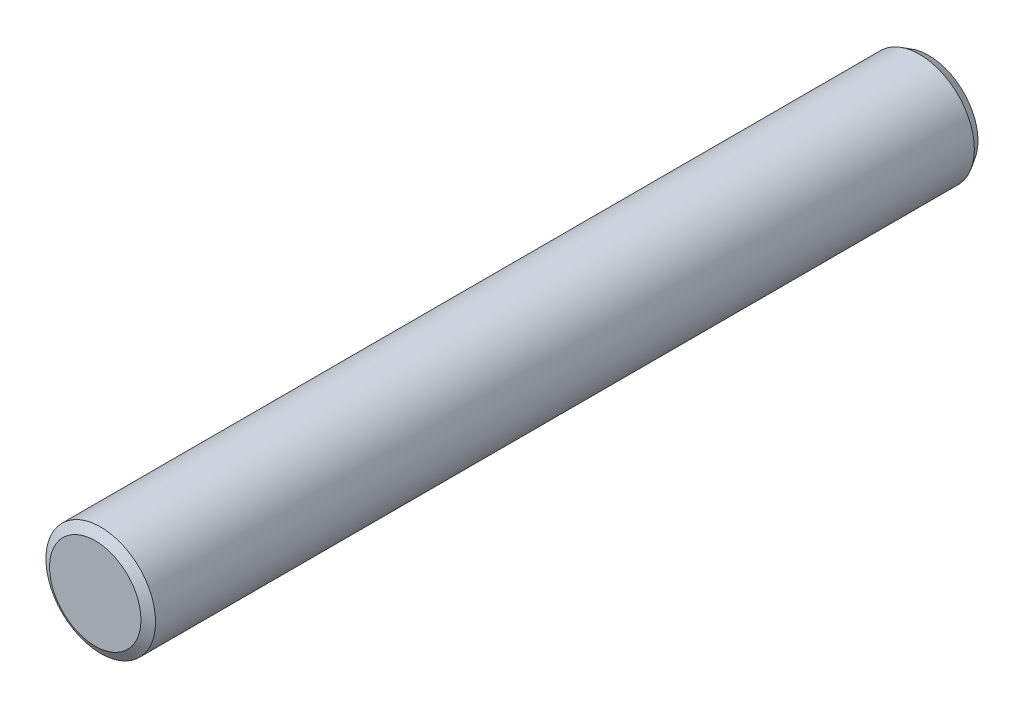
ISO-10303-21;
HEADER;
FILE_DESCRIPTION(('STEP AP214'),'2;1');
FILE_NAME('part.step','',(''),(''),'','','');
FILE_SCHEMA(('AUTOMOTIVE_DESIGN { 1 0 10303 214 1 1 1 1 }'));
ENDSEC;
DATA;
#1=APPLICATION_CONTEXT('core data for automotive mechanical design processes');
#2=APPLICATION_PROTOCOL_DEFINITION('international standard','automotive_design',2000,#1);
#3=PRODUCT_CONTEXT('',#1,'mechanical');
#4=PRODUCT('Part','Part','',(#3));
#5=PRODUCT_RELATED_PRODUCT_CATEGORY('part','',(#4));
#6=PRODUCT_DEFINITION_FORMATION('','',#4);
#7=PRODUCT_DEFINITION_CONTEXT('part definition',#1,'design');
#8=PRODUCT_DEFINITION('design','',#6,#7);
#9=PRODUCT_DEFINITION_SHAPE('','',#8);
#10=(LENGTH_UNIT() NAMED_UNIT(*) SI_UNIT(.MILLI.,.METRE.));
#11=(NAMED_UNIT(*) PLANE_ANGLE_UNIT() SI_UNIT($,.RADIAN.));
#12=(NAMED_UNIT(*) SI_UNIT($,.STERADIAN.) SOLID_ANGLE_UNIT());
#13=UNCERTAINTY_MEASURE_WITH_UNIT(LENGTH_MEASURE(1.E-05),#10,'distance_accuracy_value','');
#14=(GEOMETRIC_REPRESENTATION_CONTEXT(3) GLOBAL_UNCERTAINTY_ASSIGNED_CONTEXT((#13)) GLOBAL_UNIT_ASSIGNED_CONTEXT((#10,
#11,#12)) REPRESENTATION_CONTEXT('',''));
#15=CARTESIAN_POINT('',(0.,0.,0.));
#16=DIRECTION('',(0.,0.,1.));
#17=DIRECTION('',(1.,0.,0.));
#18=AXIS2_PLACEMENT_3D('',#15,#16,#17);
#19=CARTESIAN_POINT('',(0.,0.,76.));
#20=DIRECTION('',(0.,0.,-1.));
#21=DIRECTION('',(-1.,0.,0.));
#22=AXIS2_PLACEMENT_3D('',#19,#20,#21);
#23=CYLINDRICAL_SURFACE('',#22,5.);
#24=CARTESIAN_POINT('',(0.,0.,0.832139741175242));
#25=DIRECTION('',(0.,0.,1.));
#26=DIRECTION('',(1.,0.,0.));
#27=AXIS2_PLACEMENT_3D('',#24,#25,#26);
#28=CIRCLE('',#27,5.);
#29=CARTESIAN_POINT('',(5.,0.,0.832139741175242));
#30=VERTEX_POINT('',#29);
#31=EDGE_CURVE('E50',#30,#30,#28,.T.);
#32=ORIENTED_EDGE('',*,*,#31,.T.);
#33=EDGE_LOOP('',(#32));
#34=FACE_BOUND('',#33,.T.);
#35=CARTESIAN_POINT('',(0.,0.,75.5));
#36=DIRECTION('',(0.,0.,1.));
#37=DIRECTION('',(1.,0.,0.));
#38=AXIS2_PLACEMENT_3D('',#35,#36,#37);
#39=CIRCLE('',#38,5.);
#40=CARTESIAN_POINT('',(5.,0.,75.5));
#41=VERTEX_POINT('',#40);
#42=EDGE_CURVE('E54',#41,#41,#39,.F.);
#43=ORIENTED_EDGE('',*,*,#42,.T.);
#44=EDGE_LOOP('',(#43));
#45=FACE_BOUND('',#44,.T.);
#46=ADVANCED_FACE('F38',(#34,#45),#23,.T.);
#47=CARTESIAN_POINT('',(0.,0.,76.));
#48=DIRECTION('',(0.,0.,1.));
#49=DIRECTION('',(1.,0.,0.));
#50=AXIS2_PLACEMENT_3D('',#47,#48,#49);
#51=PLANE('',#50);
#52=CARTESIAN_POINT('',(0.,0.,76.));
#53=DIRECTION('',(0.,0.,1.));
#54=DIRECTION('',(1.,0.,0.));
#55=AXIS2_PLACEMENT_3D('',#52,#53,#54);
#56=CIRCLE('',#55,4.16786025882475);
#57=CARTESIAN_POINT('',(4.16786025882475,0.,76.));
#58=VERTEX_POINT('',#57);
#59=EDGE_CURVE('E10',#58,#58,#56,.T.);
#60=ORIENTED_EDGE('',*,*,#59,.T.);
#61=EDGE_LOOP('',(#60));
#62=FACE_BOUND('',#61,.T.);
#63=ADVANCED_FACE('F70',(#62),#51,.T.);
#64=CARTESIAN_POINT('',(0.,0.,0.));
#65=DIRECTION('',(0.,0.,1.));
#66=DIRECTION('',(1.,0.,0.));
#67=AXIS2_PLACEMENT_3D('',#64,#65,#66);
#68=PLANE('',#67);
#69=CARTESIAN_POINT('',(0.,0.,0.));
#70=DIRECTION('',(0.,0.,1.));
#71=DIRECTION('',(1.,0.,0.));
#72=AXIS2_PLACEMENT_3D('',#69,#70,#71);
#73=CIRCLE('',#72,4.50000000000001);
#74=CARTESIAN_POINT('',(4.50000000000001,0.,0.));
#75=VERTEX_POINT('',#74);
#76=EDGE_CURVE('E46',#75,#75,#73,.F.);
#77=ORIENTED_EDGE('',*,*,#76,.T.);
#78=EDGE_LOOP('',(#77));
#79=FACE_BOUND('',#78,.T.);
#80=ADVANCED_FACE('F67',(#79),#68,.F.);
#81=CARTESIAN_POINT('',(0.,0.,0.832139741175242));
#82=DIRECTION('',(0.,0.,1.));
#83=DIRECTION('',(1.,0.,0.));
#84=AXIS2_PLACEMENT_3D('',#81,#82,#83);
#85=CONICAL_SURFACE('',#84,5.,0.541052068118242);
#86=ORIENTED_EDGE('',*,*,#76,.F.);
#87=EDGE_LOOP('',(#86));
#88=FACE_BOUND('',#87,.T.);
#89=ORIENTED_EDGE('',*,*,#31,.F.);
#90=EDGE_LOOP('',(#89));
#91=FACE_BOUND('',#90,.T.);
#92=ADVANCED_FACE('F63',(#88,#91),#85,.T.);
#93=CARTESIAN_POINT('',(0.,0.,76.));
#94=DIRECTION('',(0.,0.,-1.));
#95=DIRECTION('',(-1.,0.,0.));
#96=AXIS2_PLACEMENT_3D('',#93,#94,#95);
#97=CONICAL_SURFACE('',#96,4.16786025882475,1.02974425867665);
#98=ORIENTED_EDGE('',*,*,#42,.F.);
#99=EDGE_LOOP('',(#98));
#100=FACE_BOUND('',#99,.T.);
#101=ORIENTED_EDGE('',*,*,#59,.F.);
#102=EDGE_LOOP('',(#101));
#103=FACE_BOUND('',#102,.T.);
#104=ADVANCED_FACE('F41',(#100,#103),#97,.T.);
#105=CLOSED_SHELL('',(#46,#63,#80,#92,#104));
#106=MANIFOLD_SOLID_BREP('B2',#105);
#107=ADVANCED_BREP_SHAPE_REPRESENTATION('',(#18,#106),#14);
#108=SHAPE_DEFINITION_REPRESENTATION(#9,#107);
ENDSEC;
END-ISO-10303-21;
